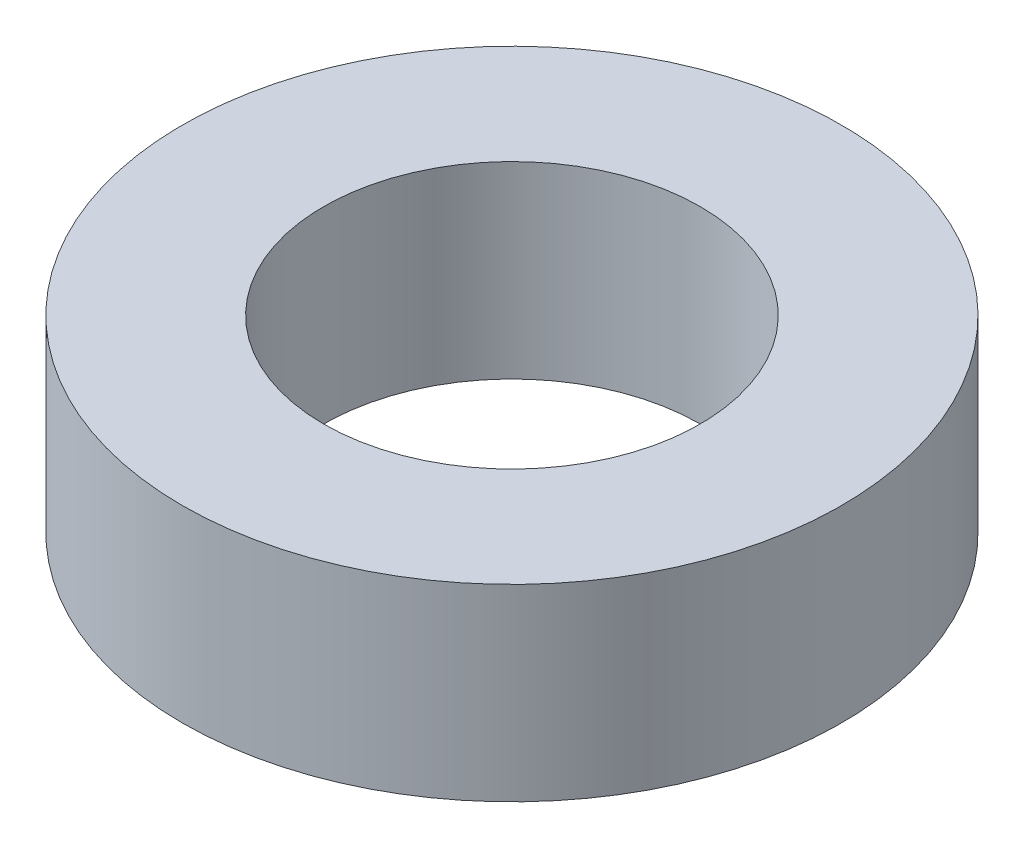
ISO-10303-21;
HEADER;
FILE_DESCRIPTION(('STEP AP214'),'2;1');
FILE_NAME('part.step','',(''),(''),'','','');
FILE_SCHEMA(('AUTOMOTIVE_DESIGN { 1 0 10303 214 1 1 1 1 }'));
ENDSEC;
DATA;
#1=APPLICATION_CONTEXT('core data for automotive mechanical design processes');
#2=APPLICATION_PROTOCOL_DEFINITION('international standard','automotive_design',2000,#1);
#3=PRODUCT_CONTEXT('',#1,'mechanical');
#4=PRODUCT('Part','Part','',(#3));
#5=PRODUCT_RELATED_PRODUCT_CATEGORY('part','',(#4));
#6=PRODUCT_DEFINITION_FORMATION('','',#4);
#7=PRODUCT_DEFINITION_CONTEXT('part definition',#1,'design');
#8=PRODUCT_DEFINITION('design','',#6,#7);
#9=PRODUCT_DEFINITION_SHAPE('','',#8);
#10=(LENGTH_UNIT() NAMED_UNIT(*) SI_UNIT(.MILLI.,.METRE.));
#11=(NAMED_UNIT(*) PLANE_ANGLE_UNIT() SI_UNIT($,.RADIAN.));
#12=(NAMED_UNIT(*) SI_UNIT($,.STERADIAN.) SOLID_ANGLE_UNIT());
#13=UNCERTAINTY_MEASURE_WITH_UNIT(LENGTH_MEASURE(1.E-05),#10,'distance_accuracy_value','');
#14=(GEOMETRIC_REPRESENTATION_CONTEXT(3) GLOBAL_UNCERTAINTY_ASSIGNED_CONTEXT((#13)) GLOBAL_UNIT_ASSIGNED_CONTEXT((#10,
#11,#12)) REPRESENTATION_CONTEXT('',''));
#15=CARTESIAN_POINT('',(0.,0.,0.));
#16=DIRECTION('',(0.,0.,1.));
#17=DIRECTION('',(1.,0.,0.));
#18=AXIS2_PLACEMENT_3D('',#15,#16,#17);
#19=CARTESIAN_POINT('',(0.,2.,0.));
#20=DIRECTION('',(0.,1.,0.));
#21=DIRECTION('',(0.,0.,1.));
#22=AXIS2_PLACEMENT_3D('',#19,#20,#21);
#23=PLANE('',#22);
#24=CARTESIAN_POINT('',(0.,2.,0.));
#25=DIRECTION('',(0.,1.,0.));
#26=DIRECTION('',(0.,0.,1.));
#27=AXIS2_PLACEMENT_3D('',#24,#25,#26);
#28=CIRCLE('',#27,3.5);
#29=CARTESIAN_POINT('',(0.,2.,3.5));
#30=VERTEX_POINT('',#29);
#31=EDGE_CURVE('E10',#30,#30,#28,.T.);
#32=ORIENTED_EDGE('',*,*,#31,.T.);
#33=EDGE_LOOP('',(#32));
#34=FACE_BOUND('',#33,.T.);
#35=CARTESIAN_POINT('',(0.,2.,0.));
#36=DIRECTION('',(0.,1.,0.));
#37=DIRECTION('',(0.,0.,1.));
#38=AXIS2_PLACEMENT_3D('',#35,#36,#37);
#39=CIRCLE('',#38,2.);
#40=CARTESIAN_POINT('',(0.,2.,2.));
#41=VERTEX_POINT('',#40);
#42=EDGE_CURVE('E41',#41,#41,#39,.T.);
#43=ORIENTED_EDGE('',*,*,#42,.F.);
#44=EDGE_LOOP('',(#43));
#45=FACE_BOUND('',#44,.T.);
#46=ADVANCED_FACE('F30',(#34,#45),#23,.T.);
#47=CARTESIAN_POINT('',(0.,0.,0.));
#48=DIRECTION('',(0.,1.,0.));
#49=DIRECTION('',(0.,0.,1.));
#50=AXIS2_PLACEMENT_3D('',#47,#48,#49);
#51=PLANE('',#50);
#52=CARTESIAN_POINT('',(0.,0.,0.));
#53=DIRECTION('',(0.,1.,0.));
#54=DIRECTION('',(0.,0.,1.));
#55=AXIS2_PLACEMENT_3D('',#52,#53,#54);
#56=CIRCLE('',#55,3.5);
#57=CARTESIAN_POINT('',(0.,0.,3.5));
#58=VERTEX_POINT('',#57);
#59=EDGE_CURVE('E34',#58,#58,#56,.T.);
#60=ORIENTED_EDGE('',*,*,#59,.F.);
#61=EDGE_LOOP('',(#60));
#62=FACE_BOUND('',#61,.T.);
#63=CARTESIAN_POINT('',(0.,0.,0.));
#64=DIRECTION('',(0.,1.,0.));
#65=DIRECTION('',(0.,0.,1.));
#66=AXIS2_PLACEMENT_3D('',#63,#64,#65);
#67=CIRCLE('',#66,2.);
#68=CARTESIAN_POINT('',(0.,0.,2.));
#69=VERTEX_POINT('',#68);
#70=EDGE_CURVE('E43',#69,#69,#67,.T.);
#71=ORIENTED_EDGE('',*,*,#70,.T.);
#72=EDGE_LOOP('',(#71));
#73=FACE_BOUND('',#72,.T.);
#74=ADVANCED_FACE('F53',(#62,#73),#51,.F.);
#75=CARTESIAN_POINT('',(0.,2.,0.));
#76=DIRECTION('',(0.,-1.,0.));
#77=DIRECTION('',(0.,0.,-1.));
#78=AXIS2_PLACEMENT_3D('',#75,#76,#77);
#79=CYLINDRICAL_SURFACE('',#78,3.5);
#80=ORIENTED_EDGE('',*,*,#31,.F.);
#81=EDGE_LOOP('',(#80));
#82=FACE_BOUND('',#81,.T.);
#83=ORIENTED_EDGE('',*,*,#59,.T.);
#84=EDGE_LOOP('',(#83));
#85=FACE_BOUND('',#84,.T.);
#86=ADVANCED_FACE('F32',(#82,#85),#79,.T.);
#87=CARTESIAN_POINT('',(0.,2.,0.));
#88=DIRECTION('',(0.,-1.,0.));
#89=DIRECTION('',(0.,0.,-1.));
#90=AXIS2_PLACEMENT_3D('',#87,#88,#89);
#91=CYLINDRICAL_SURFACE('',#90,2.);
#92=ORIENTED_EDGE('',*,*,#42,.T.);
#93=EDGE_LOOP('',(#92));
#94=FACE_BOUND('',#93,.T.);
#95=ORIENTED_EDGE('',*,*,#70,.F.);
#96=EDGE_LOOP('',(#95));
#97=FACE_BOUND('',#96,.T.);
#98=ADVANCED_FACE('F49',(#94,#97),#91,.F.);
#99=CLOSED_SHELL('',(#46,#74,#86,#98));
#100=MANIFOLD_SOLID_BREP('B2',#99);
#101=ADVANCED_BREP_SHAPE_REPRESENTATION('',(#18,#100),#14);
#102=SHAPE_DEFINITION_REPRESENTATION(#9,#101);
ENDSEC;
END-ISO-10303-21;
